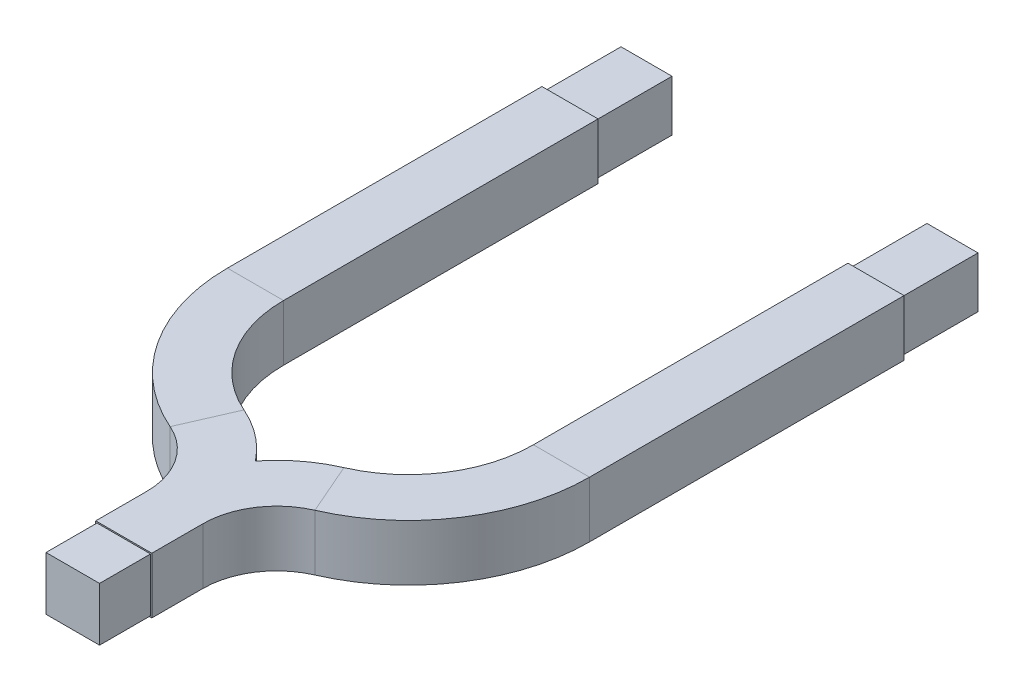
ISO-10303-21;
HEADER;
FILE_DESCRIPTION(('STEP AP214'),'2;1');
FILE_NAME('part.step','',(''),(''),'','','');
FILE_SCHEMA(('AUTOMOTIVE_DESIGN { 1 0 10303 214 1 1 1 1 }'));
ENDSEC;
DATA;
#1=APPLICATION_CONTEXT('core data for automotive mechanical design processes');
#2=APPLICATION_PROTOCOL_DEFINITION('international standard','automotive_design',2000,#1);
#3=PRODUCT_CONTEXT('',#1,'mechanical');
#4=PRODUCT('Part','Part','',(#3));
#5=PRODUCT_RELATED_PRODUCT_CATEGORY('part','',(#4));
#6=PRODUCT_DEFINITION_FORMATION('','',#4);
#7=PRODUCT_DEFINITION_CONTEXT('part definition',#1,'design');
#8=PRODUCT_DEFINITION('design','',#6,#7);
#9=PRODUCT_DEFINITION_SHAPE('','',#8);
#10=(LENGTH_UNIT() NAMED_UNIT(*) SI_UNIT(.MILLI.,.METRE.));
#11=(NAMED_UNIT(*) PLANE_ANGLE_UNIT() SI_UNIT($,.RADIAN.));
#12=(NAMED_UNIT(*) SI_UNIT($,.STERADIAN.) SOLID_ANGLE_UNIT());
#13=UNCERTAINTY_MEASURE_WITH_UNIT(LENGTH_MEASURE(1.E-05),#10,'distance_accuracy_value','');
#14=(GEOMETRIC_REPRESENTATION_CONTEXT(3) GLOBAL_UNCERTAINTY_ASSIGNED_CONTEXT((#13)) GLOBAL_UNIT_ASSIGNED_CONTEXT((#10,
#11,#12)) REPRESENTATION_CONTEXT('',''));
#15=CARTESIAN_POINT('',(0.,0.,0.));
#16=DIRECTION('',(0.,0.,1.));
#17=DIRECTION('',(1.,0.,0.));
#18=AXIS2_PLACEMENT_3D('',#15,#16,#17);
#19=CARTESIAN_POINT('',(-4.99999919028007,-0.999999999999999,-23.5));
#20=DIRECTION('',(0.,1.,0.));
#21=DIRECTION('',(-1.,0.,0.));
#22=AXIS2_PLACEMENT_3D('',#19,#20,#21);
#23=PLANE('',#22);
#24=DIRECTION('',(1.,0.,0.));
#25=VECTOR('',#24,1.);
#26=CARTESIAN_POINT('',(-6.99999919028007,-0.999999999999999,-26.5));
#27=LINE('',#26,#25);
#28=CARTESIAN_POINT('',(-6.99999919028007,-1.,-26.5));
#29=VERTEX_POINT('',#28);
#30=CARTESIAN_POINT('',(-4.99999919028007,-0.999999999999999,-26.5));
#31=VERTEX_POINT('',#30);
#32=EDGE_CURVE('E61',#29,#31,#27,.T.);
#33=ORIENTED_EDGE('',*,*,#32,.T.);
#34=DIRECTION('',(0.,0.,-1.));
#35=VECTOR('',#34,1.);
#36=CARTESIAN_POINT('',(-4.99999919028007,-0.999999999999999,-23.5));
#37=LINE('',#36,#35);
#38=CARTESIAN_POINT('',(-4.99999919028007,-0.999999999999999,-23.5));
#39=VERTEX_POINT('',#38);
#40=EDGE_CURVE('E263',#39,#31,#37,.T.);
#41=ORIENTED_EDGE('',*,*,#40,.F.);
#42=DIRECTION('',(1.,0.,0.));
#43=VECTOR('',#42,1.);
#44=CARTESIAN_POINT('',(-4.99999919028007,-0.999999999999999,-23.5));
#45=LINE('',#44,#43);
#46=CARTESIAN_POINT('',(-6.99999919028007,-1.,-23.5));
#47=VERTEX_POINT('',#46);
#48=EDGE_CURVE('E777',#47,#39,#45,.T.);
#49=ORIENTED_EDGE('',*,*,#48,.F.);
#50=DIRECTION('',(0.,0.,-1.));
#51=VECTOR('',#50,1.);
#52=CARTESIAN_POINT('',(-6.99999919028007,-1.,-23.5));
#53=LINE('',#52,#51);
#54=EDGE_CURVE('E259',#47,#29,#53,.T.);
#55=ORIENTED_EDGE('',*,*,#54,.T.);
#56=EDGE_LOOP('',(#33,#41,#49,#55));
#57=FACE_BOUND('',#56,.T.);
#58=ADVANCED_FACE('F45',(#57),#23,.F.);
#59=CARTESIAN_POINT('',(-4.99999919028007,-0.999999999999999,-23.5));
#60=DIRECTION('',(-1.,0.,0.));
#61=DIRECTION('',(0.,0.,1.));
#62=AXIS2_PLACEMENT_3D('',#59,#60,#61);
#63=PLANE('',#62);
#64=DIRECTION('',(0.,1.,0.));
#65=VECTOR('',#64,1.);
#66=CARTESIAN_POINT('',(-4.99999919028007,1.,-26.5));
#67=LINE('',#66,#65);
#68=CARTESIAN_POINT('',(-4.99999919028007,1.,-26.5));
#69=VERTEX_POINT('',#68);
#70=EDGE_CURVE('E253',#31,#69,#67,.T.);
#71=ORIENTED_EDGE('',*,*,#70,.T.);
#72=DIRECTION('',(0.,0.,-1.));
#73=VECTOR('',#72,1.);
#74=CARTESIAN_POINT('',(-4.99999919028007,1.,-23.5));
#75=LINE('',#74,#73);
#76=CARTESIAN_POINT('',(-4.99999919028007,1.,-23.5));
#77=VERTEX_POINT('',#76);
#78=EDGE_CURVE('E251',#77,#69,#75,.T.);
#79=ORIENTED_EDGE('',*,*,#78,.F.);
#80=DIRECTION('',(0.,1.,0.));
#81=VECTOR('',#80,1.);
#82=CARTESIAN_POINT('',(-4.99999919028007,-0.999999999999999,-23.5));
#83=LINE('',#82,#81);
#84=EDGE_CURVE('E265',#39,#77,#83,.T.);
#85=ORIENTED_EDGE('',*,*,#84,.F.);
#86=ORIENTED_EDGE('',*,*,#40,.T.);
#87=EDGE_LOOP('',(#71,#79,#85,#86));
#88=FACE_BOUND('',#87,.T.);
#89=ADVANCED_FACE('F596',(#88),#63,.F.);
#90=CARTESIAN_POINT('',(-4.99999919028007,1.,-23.5));
#91=DIRECTION('',(0.,-1.,0.));
#92=DIRECTION('',(1.,0.,0.));
#93=AXIS2_PLACEMENT_3D('',#90,#91,#92);
#94=PLANE('',#93);
#95=DIRECTION('',(-1.,0.,0.));
#96=VECTOR('',#95,1.);
#97=CARTESIAN_POINT('',(-6.99999919028007,1.,-26.5));
#98=LINE('',#97,#96);
#99=CARTESIAN_POINT('',(-6.99999919028007,1.,-26.5));
#100=VERTEX_POINT('',#99);
#101=EDGE_CURVE('E236',#69,#100,#98,.T.);
#102=ORIENTED_EDGE('',*,*,#101,.T.);
#103=DIRECTION('',(0.,0.,-1.));
#104=VECTOR('',#103,1.);
#105=CARTESIAN_POINT('',(-6.99999919028007,1.,-23.5));
#106=LINE('',#105,#104);
#107=CARTESIAN_POINT('',(-6.99999919028007,1.,-23.5));
#108=VERTEX_POINT('',#107);
#109=EDGE_CURVE('E248',#108,#100,#106,.T.);
#110=ORIENTED_EDGE('',*,*,#109,.F.);
#111=DIRECTION('',(-1.,0.,0.));
#112=VECTOR('',#111,1.);
#113=CARTESIAN_POINT('',(-4.99999919028007,1.,-23.5));
#114=LINE('',#113,#112);
#115=EDGE_CURVE('E785',#77,#108,#114,.T.);
#116=ORIENTED_EDGE('',*,*,#115,.F.);
#117=ORIENTED_EDGE('',*,*,#78,.T.);
#118=EDGE_LOOP('',(#102,#110,#116,#117));
#119=FACE_BOUND('',#118,.T.);
#120=ADVANCED_FACE('F246',(#119),#94,.F.);
#121=CARTESIAN_POINT('',(-6.99999919028007,-1.,-23.5));
#122=DIRECTION('',(1.,0.,0.));
#123=DIRECTION('',(0.,0.,-1.));
#124=AXIS2_PLACEMENT_3D('',#121,#122,#123);
#125=PLANE('',#124);
#126=DIRECTION('',(0.,-1.,0.));
#127=VECTOR('',#126,1.);
#128=CARTESIAN_POINT('',(-6.99999919028007,1.,-26.5));
#129=LINE('',#128,#127);
#130=EDGE_CURVE('E233',#100,#29,#129,.T.);
#131=ORIENTED_EDGE('',*,*,#130,.T.);
#132=ORIENTED_EDGE('',*,*,#54,.F.);
#133=DIRECTION('',(0.,-1.,0.));
#134=VECTOR('',#133,1.);
#135=CARTESIAN_POINT('',(-6.99999919028007,-1.,-23.5));
#136=LINE('',#135,#134);
#137=EDGE_CURVE('E257',#108,#47,#136,.T.);
#138=ORIENTED_EDGE('',*,*,#137,.F.);
#139=ORIENTED_EDGE('',*,*,#109,.T.);
#140=EDGE_LOOP('',(#131,#132,#138,#139));
#141=FACE_BOUND('',#140,.T.);
#142=ADVANCED_FACE('F256',(#141),#125,.F.);
#143=CARTESIAN_POINT('',(-4.89999919028007,1.1,-28.5));
#144=DIRECTION('',(-1.,0.,0.));
#145=DIRECTION('',(0.,0.,1.));
#146=AXIS2_PLACEMENT_3D('',#143,#144,#145);
#147=PLANE('',#146);
#148=DIRECTION('',(0.,1.,0.));
#149=VECTOR('',#148,1.);
#150=CARTESIAN_POINT('',(-4.89999919028007,-1.1,-23.5));
#151=LINE('',#150,#149);
#152=CARTESIAN_POINT('',(-4.89999919028007,-1.1,-23.5));
#153=VERTEX_POINT('',#152);
#154=CARTESIAN_POINT('',(-4.89999919028007,1.1,-23.5));
#155=VERTEX_POINT('',#154);
#156=EDGE_CURVE('E269',#153,#155,#151,.T.);
#157=ORIENTED_EDGE('',*,*,#156,.T.);
#158=DIRECTION('',(0.,0.,1.));
#159=VECTOR('',#158,1.);
#160=CARTESIAN_POINT('',(-4.89999919028007,1.1,-28.5));
#161=LINE('',#160,#159);
#162=CARTESIAN_POINT('',(-4.89999919028007,1.1,-11.1651484449888));
#163=VERTEX_POINT('',#162);
#164=EDGE_CURVE('E338',#155,#163,#161,.T.);
#165=ORIENTED_EDGE('',*,*,#164,.T.);
#166=DIRECTION('',(0.,1.,0.));
#167=VECTOR('',#166,1.);
#168=CARTESIAN_POINT('',(-4.89999919028007,1.1,-11.1651484449888));
#169=LINE('',#168,#167);
#170=CARTESIAN_POINT('',(-4.89999919028007,-1.1,-11.1651484449888));
#171=VERTEX_POINT('',#170);
#172=EDGE_CURVE('E339',#163,#171,#169,.F.);
#173=ORIENTED_EDGE('',*,*,#172,.T.);
#174=DIRECTION('',(0.,0.,1.));
#175=VECTOR('',#174,1.);
#176=CARTESIAN_POINT('',(-4.89999919028007,-1.1,-28.5));
#177=LINE('',#176,#175);
#178=EDGE_CURVE('E343',#153,#171,#177,.T.);
#179=ORIENTED_EDGE('',*,*,#178,.F.);
#180=EDGE_LOOP('',(#157,#165,#173,#179));
#181=FACE_BOUND('',#180,.T.);
#182=ADVANCED_FACE('F638',(#181),#147,.F.);
#183=CARTESIAN_POINT('',(-7.09999919028007,-1.1,-28.5));
#184=DIRECTION('',(0.,1.,0.));
#185=DIRECTION('',(0.,0.,1.));
#186=AXIS2_PLACEMENT_3D('',#183,#184,#185);
#187=PLANE('',#186);
#188=DIRECTION('',(1.,0.,0.));
#189=VECTOR('',#188,1.);
#190=CARTESIAN_POINT('',(-4.89999919028007,-1.1,-23.5));
#191=LINE('',#190,#189);
#192=CARTESIAN_POINT('',(-7.09999919028007,-1.1,-23.5));
#193=VERTEX_POINT('',#192);
#194=EDGE_CURVE('E273',#193,#153,#191,.T.);
#195=ORIENTED_EDGE('',*,*,#194,.T.);
#196=ORIENTED_EDGE('',*,*,#178,.T.);
#197=DIRECTION('',(1.,0.,0.));
#198=VECTOR('',#197,1.);
#199=CARTESIAN_POINT('',(-7.09999919028007,-1.1,-11.1651484449888));
#200=LINE('',#199,#198);
#201=CARTESIAN_POINT('',(-7.09999919028007,-1.1,-11.1651484449888));
#202=VERTEX_POINT('',#201);
#203=EDGE_CURVE('E346',#171,#202,#200,.F.);
#204=ORIENTED_EDGE('',*,*,#203,.T.);
#205=DIRECTION('',(0.,0.,1.));
#206=VECTOR('',#205,1.);
#207=CARTESIAN_POINT('',(-7.09999919028007,-1.1,-28.5));
#208=LINE('',#207,#206);
#209=EDGE_CURVE('E375',#193,#202,#208,.T.);
#210=ORIENTED_EDGE('',*,*,#209,.F.);
#211=EDGE_LOOP('',(#195,#196,#204,#210));
#212=FACE_BOUND('',#211,.T.);
#213=ADVANCED_FACE('F641',(#212),#187,.F.);
#214=CARTESIAN_POINT('',(-7.09999919028007,1.1,-28.5));
#215=DIRECTION('',(1.,0.,0.));
#216=DIRECTION('',(0.,0.,-1.));
#217=AXIS2_PLACEMENT_3D('',#214,#215,#216);
#218=PLANE('',#217);
#219=DIRECTION('',(0.,-1.,0.));
#220=VECTOR('',#219,1.);
#221=CARTESIAN_POINT('',(-7.09999919028007,-1.1,-23.5));
#222=LINE('',#221,#220);
#223=CARTESIAN_POINT('',(-7.09999919028007,1.1,-23.5));
#224=VERTEX_POINT('',#223);
#225=EDGE_CURVE('E69',#224,#193,#222,.T.);
#226=ORIENTED_EDGE('',*,*,#225,.T.);
#227=ORIENTED_EDGE('',*,*,#209,.T.);
#228=DIRECTION('',(0.,-1.,0.));
#229=VECTOR('',#228,1.);
#230=CARTESIAN_POINT('',(-7.09999919028007,1.1,-11.1651484449888));
#231=LINE('',#230,#229);
#232=CARTESIAN_POINT('',(-7.09999919028007,1.1,-11.1651484449888));
#233=VERTEX_POINT('',#232);
#234=EDGE_CURVE('E378',#202,#233,#231,.F.);
#235=ORIENTED_EDGE('',*,*,#234,.T.);
#236=DIRECTION('',(0.,0.,1.));
#237=VECTOR('',#236,1.);
#238=CARTESIAN_POINT('',(-7.09999919028007,1.1,-28.5));
#239=LINE('',#238,#237);
#240=EDGE_CURVE('E393',#224,#233,#239,.T.);
#241=ORIENTED_EDGE('',*,*,#240,.F.);
#242=EDGE_LOOP('',(#226,#227,#235,#241));
#243=FACE_BOUND('',#242,.T.);
#244=ADVANCED_FACE('F655',(#243),#218,.F.);
#245=CARTESIAN_POINT('',(-7.09999919028007,1.1,-28.5));
#246=DIRECTION('',(0.,-1.,0.));
#247=DIRECTION('',(0.,0.,-1.));
#248=AXIS2_PLACEMENT_3D('',#245,#246,#247);
#249=PLANE('',#248);
#250=DIRECTION('',(-1.,0.,0.));
#251=VECTOR('',#250,1.);
#252=CARTESIAN_POINT('',(-4.89999919028007,1.1,-23.5));
#253=LINE('',#252,#251);
#254=EDGE_CURVE('E279',#155,#224,#253,.T.);
#255=ORIENTED_EDGE('',*,*,#254,.T.);
#256=ORIENTED_EDGE('',*,*,#240,.T.);
#257=DIRECTION('',(-1.,0.,0.));
#258=VECTOR('',#257,1.);
#259=CARTESIAN_POINT('',(-7.09999919028007,1.1,-11.1651484449888));
#260=LINE('',#259,#258);
#261=EDGE_CURVE('E362',#233,#163,#260,.F.);
#262=ORIENTED_EDGE('',*,*,#261,.T.);
#263=ORIENTED_EDGE('',*,*,#164,.F.);
#264=EDGE_LOOP('',(#255,#256,#262,#263));
#265=FACE_BOUND('',#264,.T.);
#266=ADVANCED_FACE('F631',(#265),#249,.F.);
#267=CARTESIAN_POINT('',(4.99999919028007,-0.999999999999999,-23.5));
#268=DIRECTION('',(0.,-1.,0.));
#269=DIRECTION('',(1.,0.,0.));
#270=AXIS2_PLACEMENT_3D('',#267,#268,#269);
#271=PLANE('',#270);
#272=DIRECTION('',(0.,0.,-1.));
#273=VECTOR('',#272,1.);
#274=CARTESIAN_POINT('',(4.99999919028007,-0.999999999999999,-23.5));
#275=LINE('',#274,#273);
#276=CARTESIAN_POINT('',(4.99999919028007,-0.999999999999999,-23.5));
#277=VERTEX_POINT('',#276);
#278=CARTESIAN_POINT('',(4.99999919028007,-0.999999999999999,-26.5));
#279=VERTEX_POINT('',#278);
#280=EDGE_CURVE('E310',#277,#279,#275,.T.);
#281=ORIENTED_EDGE('',*,*,#280,.T.);
#282=DIRECTION('',(-1.,0.,0.));
#283=VECTOR('',#282,1.);
#284=CARTESIAN_POINT('',(6.99999919028007,-0.999999999999999,-26.5));
#285=LINE('',#284,#283);
#286=CARTESIAN_POINT('',(6.99999919028007,-0.999999999999999,-26.5));
#287=VERTEX_POINT('',#286);
#288=EDGE_CURVE('E285',#287,#279,#285,.T.);
#289=ORIENTED_EDGE('',*,*,#288,.F.);
#290=DIRECTION('',(0.,0.,-1.));
#291=VECTOR('',#290,1.);
#292=CARTESIAN_POINT('',(6.99999919028007,-1.,-23.5));
#293=LINE('',#292,#291);
#294=CARTESIAN_POINT('',(6.99999919028007,-1.,-23.5));
#295=VERTEX_POINT('',#294);
#296=EDGE_CURVE('E311',#295,#287,#293,.T.);
#297=ORIENTED_EDGE('',*,*,#296,.F.);
#298=DIRECTION('',(-1.,0.,0.));
#299=VECTOR('',#298,1.);
#300=CARTESIAN_POINT('',(4.99999919028007,-0.999999999999999,-23.5));
#301=LINE('',#300,#299);
#302=EDGE_CURVE('E294',#295,#277,#301,.T.);
#303=ORIENTED_EDGE('',*,*,#302,.T.);
#304=EDGE_LOOP('',(#281,#289,#297,#303));
#305=FACE_BOUND('',#304,.T.);
#306=ADVANCED_FACE('F619',(#305),#271,.T.);
#307=CARTESIAN_POINT('',(6.99999919028007,-1.,-23.5));
#308=DIRECTION('',(1.,0.,0.));
#309=DIRECTION('',(0.,0.,-1.));
#310=AXIS2_PLACEMENT_3D('',#307,#308,#309);
#311=PLANE('',#310);
#312=ORIENTED_EDGE('',*,*,#296,.T.);
#313=DIRECTION('',(0.,-1.,0.));
#314=VECTOR('',#313,1.);
#315=CARTESIAN_POINT('',(6.99999919028007,1.,-26.5));
#316=LINE('',#315,#314);
#317=CARTESIAN_POINT('',(6.99999919028007,1.,-26.5));
#318=VERTEX_POINT('',#317);
#319=EDGE_CURVE('E282',#318,#287,#316,.T.);
#320=ORIENTED_EDGE('',*,*,#319,.F.);
#321=DIRECTION('',(0.,0.,-1.));
#322=VECTOR('',#321,1.);
#323=CARTESIAN_POINT('',(6.99999919028007,1.,-23.5));
#324=LINE('',#323,#322);
#325=CARTESIAN_POINT('',(6.99999919028007,1.,-23.5));
#326=VERTEX_POINT('',#325);
#327=EDGE_CURVE('E316',#326,#318,#324,.T.);
#328=ORIENTED_EDGE('',*,*,#327,.F.);
#329=DIRECTION('',(0.,-1.,0.));
#330=VECTOR('',#329,1.);
#331=CARTESIAN_POINT('',(6.99999919028007,-1.,-23.5));
#332=LINE('',#331,#330);
#333=EDGE_CURVE('E306',#326,#295,#332,.T.);
#334=ORIENTED_EDGE('',*,*,#333,.T.);
#335=EDGE_LOOP('',(#312,#320,#328,#334));
#336=FACE_BOUND('',#335,.T.);
#337=ADVANCED_FACE('F615',(#336),#311,.T.);
#338=CARTESIAN_POINT('',(4.99999919028007,1.,-23.5));
#339=DIRECTION('',(0.,1.,0.));
#340=DIRECTION('',(-1.,0.,0.));
#341=AXIS2_PLACEMENT_3D('',#338,#339,#340);
#342=PLANE('',#341);
#343=ORIENTED_EDGE('',*,*,#327,.T.);
#344=DIRECTION('',(1.,0.,0.));
#345=VECTOR('',#344,1.);
#346=CARTESIAN_POINT('',(6.99999919028007,1.,-26.5));
#347=LINE('',#346,#345);
#348=CARTESIAN_POINT('',(4.99999919028007,1.,-26.5));
#349=VERTEX_POINT('',#348);
#350=EDGE_CURVE('E291',#349,#318,#347,.T.);
#351=ORIENTED_EDGE('',*,*,#350,.F.);
#352=DIRECTION('',(0.,0.,-1.));
#353=VECTOR('',#352,1.);
#354=CARTESIAN_POINT('',(4.99999919028007,1.,-23.5));
#355=LINE('',#354,#353);
#356=CARTESIAN_POINT('',(4.99999919028007,1.,-23.5));
#357=VERTEX_POINT('',#356);
#358=EDGE_CURVE('E320',#357,#349,#355,.T.);
#359=ORIENTED_EDGE('',*,*,#358,.F.);
#360=DIRECTION('',(1.,0.,0.));
#361=VECTOR('',#360,1.);
#362=CARTESIAN_POINT('',(4.99999919028007,1.,-23.5));
#363=LINE('',#362,#361);
#364=EDGE_CURVE('E302',#357,#326,#363,.T.);
#365=ORIENTED_EDGE('',*,*,#364,.T.);
#366=EDGE_LOOP('',(#343,#351,#359,#365));
#367=FACE_BOUND('',#366,.T.);
#368=ADVANCED_FACE('F618',(#367),#342,.T.);
#369=CARTESIAN_POINT('',(4.99999919028007,-0.999999999999999,-23.5));
#370=DIRECTION('',(-1.,0.,0.));
#371=DIRECTION('',(0.,0.,1.));
#372=AXIS2_PLACEMENT_3D('',#369,#370,#371);
#373=PLANE('',#372);
#374=ORIENTED_EDGE('',*,*,#358,.T.);
#375=DIRECTION('',(0.,1.,0.));
#376=VECTOR('',#375,1.);
#377=CARTESIAN_POINT('',(4.99999919028007,1.,-26.5));
#378=LINE('',#377,#376);
#379=EDGE_CURVE('E288',#279,#349,#378,.T.);
#380=ORIENTED_EDGE('',*,*,#379,.F.);
#381=ORIENTED_EDGE('',*,*,#280,.F.);
#382=DIRECTION('',(0.,1.,0.));
#383=VECTOR('',#382,1.);
#384=CARTESIAN_POINT('',(4.99999919028007,-0.999999999999999,-23.5));
#385=LINE('',#384,#383);
#386=EDGE_CURVE('E298',#277,#357,#385,.T.);
#387=ORIENTED_EDGE('',*,*,#386,.T.);
#388=EDGE_LOOP('',(#374,#380,#381,#387));
#389=FACE_BOUND('',#388,.T.);
#390=ADVANCED_FACE('F623',(#389),#373,.T.);
#391=CARTESIAN_POINT('',(7.09999919028007,1.1,-28.5));
#392=DIRECTION('',(-1.,0.,0.));
#393=DIRECTION('',(0.,0.,1.));
#394=AXIS2_PLACEMENT_3D('',#391,#392,#393);
#395=PLANE('',#394);
#396=DIRECTION('',(0.,-1.,0.));
#397=VECTOR('',#396,1.);
#398=CARTESIAN_POINT('',(7.09999919028007,-1.1,-23.5));
#399=LINE('',#398,#397);
#400=CARTESIAN_POINT('',(7.09999919028007,1.1,-23.5));
#401=VERTEX_POINT('',#400);
#402=CARTESIAN_POINT('',(7.09999919028007,-1.1,-23.5));
#403=VERTEX_POINT('',#402);
#404=EDGE_CURVE('E332',#401,#403,#399,.T.);
#405=ORIENTED_EDGE('',*,*,#404,.F.);
#406=DIRECTION('',(0.,0.,1.));
#407=VECTOR('',#406,1.);
#408=CARTESIAN_POINT('',(7.09999919028007,1.1,-28.5));
#409=LINE('',#408,#407);
#410=CARTESIAN_POINT('',(7.09999919028007,1.1,-11.1651484449888));
#411=VERTEX_POINT('',#410);
#412=EDGE_CURVE('E406',#401,#411,#409,.T.);
#413=ORIENTED_EDGE('',*,*,#412,.T.);
#414=DIRECTION('',(0.,-1.,0.));
#415=VECTOR('',#414,1.);
#416=CARTESIAN_POINT('',(7.09999919028007,1.1,-11.1651484449888));
#417=LINE('',#416,#415);
#418=CARTESIAN_POINT('',(7.09999919028007,-1.1,-11.1651484449888));
#419=VERTEX_POINT('',#418);
#420=EDGE_CURVE('E413',#411,#419,#417,.T.);
#421=ORIENTED_EDGE('',*,*,#420,.T.);
#422=DIRECTION('',(0.,0.,1.));
#423=VECTOR('',#422,1.);
#424=CARTESIAN_POINT('',(7.09999919028007,-1.1,-28.5));
#425=LINE('',#424,#423);
#426=EDGE_CURVE('E417',#403,#419,#425,.T.);
#427=ORIENTED_EDGE('',*,*,#426,.F.);
#428=EDGE_LOOP('',(#405,#413,#421,#427));
#429=FACE_BOUND('',#428,.T.);
#430=ADVANCED_FACE('F627',(#429),#395,.F.);
#431=CARTESIAN_POINT('',(7.09999919028007,-1.1,-28.5));
#432=DIRECTION('',(0.,1.,0.));
#433=DIRECTION('',(0.,0.,1.));
#434=AXIS2_PLACEMENT_3D('',#431,#432,#433);
#435=PLANE('',#434);
#436=DIRECTION('',(-1.,0.,0.));
#437=VECTOR('',#436,1.);
#438=CARTESIAN_POINT('',(4.89999919028007,-1.1,-23.5));
#439=LINE('',#438,#437);
#440=CARTESIAN_POINT('',(4.89999919028007,-1.1,-23.5));
#441=VERTEX_POINT('',#440);
#442=EDGE_CURVE('E335',#403,#441,#439,.T.);
#443=ORIENTED_EDGE('',*,*,#442,.F.);
#444=ORIENTED_EDGE('',*,*,#426,.T.);
#445=DIRECTION('',(-1.,0.,0.));
#446=VECTOR('',#445,1.);
#447=CARTESIAN_POINT('',(7.09999919028007,-1.1,-11.1651484449888));
#448=LINE('',#447,#446);
#449=CARTESIAN_POINT('',(4.89999919028007,-1.1,-11.1651484449888));
#450=VERTEX_POINT('',#449);
#451=EDGE_CURVE('E420',#419,#450,#448,.T.);
#452=ORIENTED_EDGE('',*,*,#451,.T.);
#453=DIRECTION('',(0.,0.,1.));
#454=VECTOR('',#453,1.);
#455=CARTESIAN_POINT('',(4.89999919028007,-1.1,-28.5));
#456=LINE('',#455,#454);
#457=EDGE_CURVE('E449',#441,#450,#456,.T.);
#458=ORIENTED_EDGE('',*,*,#457,.F.);
#459=EDGE_LOOP('',(#443,#444,#452,#458));
#460=FACE_BOUND('',#459,.T.);
#461=ADVANCED_FACE('F679',(#460),#435,.F.);
#462=CARTESIAN_POINT('',(4.89999919028007,1.1,-28.5));
#463=DIRECTION('',(1.,0.,0.));
#464=DIRECTION('',(0.,0.,-1.));
#465=AXIS2_PLACEMENT_3D('',#462,#463,#464);
#466=PLANE('',#465);
#467=DIRECTION('',(0.,1.,0.));
#468=VECTOR('',#467,1.);
#469=CARTESIAN_POINT('',(4.89999919028007,-1.1,-23.5));
#470=LINE('',#469,#468);
#471=CARTESIAN_POINT('',(4.89999919028007,1.1,-23.5));
#472=VERTEX_POINT('',#471);
#473=EDGE_CURVE('E315',#441,#472,#470,.T.);
#474=ORIENTED_EDGE('',*,*,#473,.F.);
#475=ORIENTED_EDGE('',*,*,#457,.T.);
#476=DIRECTION('',(0.,1.,0.));
#477=VECTOR('',#476,1.);
#478=CARTESIAN_POINT('',(4.89999919028007,1.1,-11.1651484449888));
#479=LINE('',#478,#477);
#480=CARTESIAN_POINT('',(4.89999919028007,1.1,-11.1651484449888));
#481=VERTEX_POINT('',#480);
#482=EDGE_CURVE('E452',#450,#481,#479,.T.);
#483=ORIENTED_EDGE('',*,*,#482,.T.);
#484=DIRECTION('',(0.,0.,1.));
#485=VECTOR('',#484,1.);
#486=CARTESIAN_POINT('',(4.89999919028007,1.1,-28.5));
#487=LINE('',#486,#485);
#488=EDGE_CURVE('E468',#472,#481,#487,.T.);
#489=ORIENTED_EDGE('',*,*,#488,.F.);
#490=EDGE_LOOP('',(#474,#475,#483,#489));
#491=FACE_BOUND('',#490,.T.);
#492=ADVANCED_FACE('F692',(#491),#466,.F.);
#493=CARTESIAN_POINT('',(7.09999919028007,1.1,-28.5));
#494=DIRECTION('',(0.,-1.,0.));
#495=DIRECTION('',(0.,0.,-1.));
#496=AXIS2_PLACEMENT_3D('',#493,#494,#495);
#497=PLANE('',#496);
#498=DIRECTION('',(1.,0.,0.));
#499=VECTOR('',#498,1.);
#500=CARTESIAN_POINT('',(4.89999919028007,1.1,-23.5));
#501=LINE('',#500,#499);
#502=EDGE_CURVE('E329',#472,#401,#501,.T.);
#503=ORIENTED_EDGE('',*,*,#502,.F.);
#504=ORIENTED_EDGE('',*,*,#488,.T.);
#505=DIRECTION('',(1.,0.,0.));
#506=VECTOR('',#505,1.);
#507=CARTESIAN_POINT('',(7.09999919028007,1.1,-11.1651484449888));
#508=LINE('',#507,#506);
#509=EDGE_CURVE('E436',#481,#411,#508,.T.);
#510=ORIENTED_EDGE('',*,*,#509,.T.);
#511=ORIENTED_EDGE('',*,*,#412,.F.);
#512=EDGE_LOOP('',(#503,#504,#510,#511));
#513=FACE_BOUND('',#512,.T.);
#514=ADVANCED_FACE('F700',(#513),#497,.F.);
#515=CARTESIAN_POINT('',(4.,0.,-2.));
#516=DIRECTION('',(0.,1.,0.));
#517=DIRECTION('',(0.,0.,1.));
#518=AXIS2_PLACEMENT_3D('',#515,#516,#517);
#519=CYLINDRICAL_SURFACE('',#518,5.1);
#520=DIRECTION('',(0.,-1.,0.));
#521=VECTOR('',#520,1.);
#522=CARTESIAN_POINT('',(0.,0.,-5.16385840391127));
#523=LINE('',#522,#521);
#524=CARTESIAN_POINT('',(0.,1.1,-5.16385840391127));
#525=VERTEX_POINT('',#524);
#526=CARTESIAN_POINT('',(0.,-1.1,-5.16385840391127));
#527=VERTEX_POINT('',#526);
#528=EDGE_CURVE('E11',#525,#527,#523,.T.);
#529=ORIENTED_EDGE('',*,*,#528,.F.);
#530=CARTESIAN_POINT('',(4.,1.1,-2.));
#531=DIRECTION('',(0.,1.,0.));
#532=DIRECTION('',(-0.400000107962682,0.,-0.916515091872383));
#533=AXIS2_PLACEMENT_3D('',#530,#531,#532);
#534=CIRCLE('',#533,5.1);
#535=CARTESIAN_POINT('',(1.95999998920373,1.1,-6.67422573168165));
#536=VERTEX_POINT('',#535);
#537=EDGE_CURVE('E464',#536,#525,#534,.T.);
#538=ORIENTED_EDGE('',*,*,#537,.F.);
#539=DIRECTION('',(0.,1.,0.));
#540=VECTOR('',#539,1.);
#541=CARTESIAN_POINT('',(1.95999998920373,1.1,-6.67422573168165));
#542=LINE('',#541,#540);
#543=CARTESIAN_POINT('',(1.95999998920373,-1.1,-6.67422573168165));
#544=VERTEX_POINT('',#543);
#545=EDGE_CURVE('E460',#544,#536,#542,.T.);
#546=ORIENTED_EDGE('',*,*,#545,.F.);
#547=CARTESIAN_POINT('',(4.,-1.1,-2.));
#548=DIRECTION('',(0.,1.,0.));
#549=DIRECTION('',(-0.400000107962682,0.,-0.916515091872383));
#550=AXIS2_PLACEMENT_3D('',#547,#548,#549);
#551=CIRCLE('',#550,5.1);
#552=EDGE_CURVE('E441',#544,#527,#551,.T.);
#553=ORIENTED_EDGE('',*,*,#552,.T.);
#554=EDGE_LOOP('',(#529,#538,#546,#553));
#555=FACE_BOUND('',#554,.T.);
#556=ADVANCED_FACE('F705',(#555),#519,.T.);
#557=CARTESIAN_POINT('',(1.05,1.05,2.));
#558=DIRECTION('',(-1.,0.,0.));
#559=DIRECTION('',(0.,-1.,0.));
#560=AXIS2_PLACEMENT_3D('',#557,#558,#559);
#561=PLANE('',#560);
#562=DIRECTION('',(0.,1.,0.));
#563=VECTOR('',#562,1.);
#564=CARTESIAN_POINT('',(1.05,1.05,0.));
#565=LINE('',#564,#563);
#566=CARTESIAN_POINT('',(1.05,-1.05,0.));
#567=VERTEX_POINT('',#566);
#568=CARTESIAN_POINT('',(1.05,1.05,0.));
#569=VERTEX_POINT('',#568);
#570=EDGE_CURVE('E515',#567,#569,#565,.T.);
#571=ORIENTED_EDGE('',*,*,#570,.T.);
#572=DIRECTION('',(0.,0.,-1.));
#573=VECTOR('',#572,1.);
#574=CARTESIAN_POINT('',(1.05,1.05,2.));
#575=LINE('',#574,#573);
#576=CARTESIAN_POINT('',(1.05,1.05,2.));
#577=VERTEX_POINT('',#576);
#578=EDGE_CURVE('E54',#577,#569,#575,.T.);
#579=ORIENTED_EDGE('',*,*,#578,.F.);
#580=DIRECTION('',(0.,1.,0.));
#581=VECTOR('',#580,1.);
#582=CARTESIAN_POINT('',(1.05,1.05,2.));
#583=LINE('',#582,#581);
#584=CARTESIAN_POINT('',(1.05,-1.05,2.));
#585=VERTEX_POINT('',#584);
#586=EDGE_CURVE('E524',#585,#577,#583,.T.);
#587=ORIENTED_EDGE('',*,*,#586,.F.);
#588=DIRECTION('',(0.,0.,-1.));
#589=VECTOR('',#588,1.);
#590=CARTESIAN_POINT('',(1.05,-1.05,2.));
#591=LINE('',#590,#589);
#592=EDGE_CURVE('E538',#585,#567,#591,.T.);
#593=ORIENTED_EDGE('',*,*,#592,.T.);
#594=EDGE_LOOP('',(#571,#579,#587,#593));
#595=FACE_BOUND('',#594,.T.);
#596=ADVANCED_FACE('F47',(#595),#561,.F.);
#597=CARTESIAN_POINT('',(-1.05,1.05,2.));
#598=DIRECTION('',(0.,-1.,0.));
#599=DIRECTION('',(0.,0.,-1.));
#600=AXIS2_PLACEMENT_3D('',#597,#598,#599);
#601=PLANE('',#600);
#602=DIRECTION('',(-1.,0.,0.));
#603=VECTOR('',#602,1.);
#604=CARTESIAN_POINT('',(-1.05,1.05,0.));
#605=LINE('',#604,#603);
#606=CARTESIAN_POINT('',(-1.05,1.05,0.));
#607=VERTEX_POINT('',#606);
#608=EDGE_CURVE('E542',#569,#607,#605,.T.);
#609=ORIENTED_EDGE('',*,*,#608,.T.);
#610=DIRECTION('',(0.,0.,-1.));
#611=VECTOR('',#610,1.);
#612=CARTESIAN_POINT('',(-1.05,1.05,2.));
#613=LINE('',#612,#611);
#614=CARTESIAN_POINT('',(-1.05,1.05,2.));
#615=VERTEX_POINT('',#614);
#616=EDGE_CURVE('E560',#615,#607,#613,.T.);
#617=ORIENTED_EDGE('',*,*,#616,.F.);
#618=DIRECTION('',(-1.,0.,0.));
#619=VECTOR('',#618,1.);
#620=CARTESIAN_POINT('',(-1.05,1.05,2.));
#621=LINE('',#620,#619);
#622=EDGE_CURVE('E528',#577,#615,#621,.T.);
#623=ORIENTED_EDGE('',*,*,#622,.F.);
#624=ORIENTED_EDGE('',*,*,#578,.T.);
#625=EDGE_LOOP('',(#609,#617,#623,#624));
#626=FACE_BOUND('',#625,.T.);
#627=ADVANCED_FACE('F567',(#626),#601,.F.);
#628=CARTESIAN_POINT('',(-1.05,1.05,2.));
#629=DIRECTION('',(1.,0.,0.));
#630=DIRECTION('',(0.,1.,0.));
#631=AXIS2_PLACEMENT_3D('',#628,#629,#630);
#632=PLANE('',#631);
#633=DIRECTION('',(0.,-1.,0.));
#634=VECTOR('',#633,1.);
#635=CARTESIAN_POINT('',(-1.05,1.05,0.));
#636=LINE('',#635,#634);
#637=CARTESIAN_POINT('',(-1.05,-1.05,0.));
#638=VERTEX_POINT('',#637);
#639=EDGE_CURVE('E546',#607,#638,#636,.T.);
#640=ORIENTED_EDGE('',*,*,#639,.T.);
#641=DIRECTION('',(0.,0.,-1.));
#642=VECTOR('',#641,1.);
#643=CARTESIAN_POINT('',(-1.05,-1.05,2.));
#644=LINE('',#643,#642);
#645=CARTESIAN_POINT('',(-1.05,-1.05,2.));
#646=VERTEX_POINT('',#645);
#647=EDGE_CURVE('E556',#646,#638,#644,.T.);
#648=ORIENTED_EDGE('',*,*,#647,.F.);
#649=DIRECTION('',(0.,-1.,0.));
#650=VECTOR('',#649,1.);
#651=CARTESIAN_POINT('',(-1.05,1.05,2.));
#652=LINE('',#651,#650);
#653=EDGE_CURVE('E532',#615,#646,#652,.T.);
#654=ORIENTED_EDGE('',*,*,#653,.F.);
#655=ORIENTED_EDGE('',*,*,#616,.T.);
#656=EDGE_LOOP('',(#640,#648,#654,#655));
#657=FACE_BOUND('',#656,.T.);
#658=ADVANCED_FACE('F580',(#657),#632,.F.);
#659=CARTESIAN_POINT('',(-1.05,-1.05,2.));
#660=DIRECTION('',(0.,1.,0.));
#661=DIRECTION('',(0.,0.,1.));
#662=AXIS2_PLACEMENT_3D('',#659,#660,#661);
#663=PLANE('',#662);
#664=DIRECTION('',(1.,0.,0.));
#665=VECTOR('',#664,1.);
#666=CARTESIAN_POINT('',(-1.05,-1.05,0.));
#667=LINE('',#666,#665);
#668=EDGE_CURVE('E529',#638,#567,#667,.T.);
#669=ORIENTED_EDGE('',*,*,#668,.T.);
#670=ORIENTED_EDGE('',*,*,#592,.F.);
#671=DIRECTION('',(1.,0.,0.));
#672=VECTOR('',#671,1.);
#673=CARTESIAN_POINT('',(-1.05,-1.05,2.));
#674=LINE('',#673,#672);
#675=EDGE_CURVE('E535',#646,#585,#674,.T.);
#676=ORIENTED_EDGE('',*,*,#675,.F.);
#677=ORIENTED_EDGE('',*,*,#647,.T.);
#678=EDGE_LOOP('',(#669,#670,#676,#677));
#679=FACE_BOUND('',#678,.T.);
#680=ADVANCED_FACE('F575',(#679),#663,.F.);
#681=CARTESIAN_POINT('',(0.,0.,2.));
#682=DIRECTION('',(0.,0.,1.));
#683=DIRECTION('',(1.,0.,0.));
#684=AXIS2_PLACEMENT_3D('',#681,#682,#683);
#685=PLANE('',#684);
#686=ORIENTED_EDGE('',*,*,#586,.T.);
#687=ORIENTED_EDGE('',*,*,#622,.T.);
#688=ORIENTED_EDGE('',*,*,#653,.T.);
#689=ORIENTED_EDGE('',*,*,#675,.T.);
#690=EDGE_LOOP('',(#686,#687,#688,#689));
#691=FACE_BOUND('',#690,.T.);
#692=ADVANCED_FACE('F582',(#691),#685,.T.);
#693=CARTESIAN_POINT('',(0.,0.,0.));
#694=DIRECTION('',(0.,0.,1.));
#695=DIRECTION('',(1.,0.,0.));
#696=AXIS2_PLACEMENT_3D('',#693,#694,#695);
#697=PLANE('',#696);
#698=DIRECTION('',(0.,1.,0.));
#699=VECTOR('',#698,1.);
#700=CARTESIAN_POINT('',(1.1,1.1,0.));
#701=LINE('',#700,#699);
#702=CARTESIAN_POINT('',(1.1,-1.1,0.));
#703=VERTEX_POINT('',#702);
#704=CARTESIAN_POINT('',(1.1,1.1,0.));
#705=VERTEX_POINT('',#704);
#706=EDGE_CURVE('E481',#703,#705,#701,.T.);
#707=ORIENTED_EDGE('',*,*,#706,.T.);
#708=DIRECTION('',(-1.,0.,0.));
#709=VECTOR('',#708,1.);
#710=CARTESIAN_POINT('',(-1.1,1.1,0.));
#711=LINE('',#710,#709);
#712=CARTESIAN_POINT('',(-1.1,1.1,0.));
#713=VERTEX_POINT('',#712);
#714=EDGE_CURVE('E501',#705,#713,#711,.T.);
#715=ORIENTED_EDGE('',*,*,#714,.T.);
#716=DIRECTION('',(0.,-1.,0.));
#717=VECTOR('',#716,1.);
#718=CARTESIAN_POINT('',(-1.1,1.1,0.));
#719=LINE('',#718,#717);
#720=CARTESIAN_POINT('',(-1.1,-1.1,0.));
#721=VERTEX_POINT('',#720);
#722=EDGE_CURVE('E505',#713,#721,#719,.T.);
#723=ORIENTED_EDGE('',*,*,#722,.T.);
#724=DIRECTION('',(1.,0.,0.));
#725=VECTOR('',#724,1.);
#726=CARTESIAN_POINT('',(-1.1,-1.1,0.));
#727=LINE('',#726,#725);
#728=EDGE_CURVE('E493',#721,#703,#727,.T.);
#729=ORIENTED_EDGE('',*,*,#728,.T.);
#730=EDGE_LOOP('',(#707,#715,#723,#729));
#731=FACE_BOUND('',#730,.T.);
#732=ORIENTED_EDGE('',*,*,#570,.F.);
#733=ORIENTED_EDGE('',*,*,#668,.F.);
#734=ORIENTED_EDGE('',*,*,#639,.F.);
#735=ORIENTED_EDGE('',*,*,#608,.F.);
#736=EDGE_LOOP('',(#732,#733,#734,#735));
#737=FACE_BOUND('',#736,.T.);
#738=ADVANCED_FACE('F573',(#731,#737),#697,.T.);
#739=CARTESIAN_POINT('',(1.1,1.1,-2.));
#740=DIRECTION('',(1.,0.,0.));
#741=DIRECTION('',(0.,0.,-1.));
#742=AXIS2_PLACEMENT_3D('',#739,#740,#741);
#743=PLANE('',#742);
#744=ORIENTED_EDGE('',*,*,#706,.F.);
#745=DIRECTION('',(0.,0.,1.));
#746=VECTOR('',#745,1.);
#747=CARTESIAN_POINT('',(1.1,-1.1,-2.));
#748=LINE('',#747,#746);
#749=CARTESIAN_POINT('',(1.1,-1.1,-2.));
#750=VERTEX_POINT('',#749);
#751=EDGE_CURVE('E512',#750,#703,#748,.T.);
#752=ORIENTED_EDGE('',*,*,#751,.F.);
#753=DIRECTION('',(0.,1.,0.));
#754=VECTOR('',#753,1.);
#755=CARTESIAN_POINT('',(1.1,1.1,-2.));
#756=LINE('',#755,#754);
#757=CARTESIAN_POINT('',(1.1,1.1,-2.));
#758=VERTEX_POINT('',#757);
#759=EDGE_CURVE('E488',#750,#758,#756,.T.);
#760=ORIENTED_EDGE('',*,*,#759,.T.);
#761=DIRECTION('',(0.,0.,1.));
#762=VECTOR('',#761,1.);
#763=CARTESIAN_POINT('',(1.1,1.1,-2.));
#764=LINE('',#763,#762);
#765=EDGE_CURVE('E497',#758,#705,#764,.T.);
#766=ORIENTED_EDGE('',*,*,#765,.T.);
#767=EDGE_LOOP('',(#744,#752,#760,#766));
#768=FACE_BOUND('',#767,.T.);
#769=ADVANCED_FACE('F589',(#768),#743,.T.);
#770=CARTESIAN_POINT('',(-1.1,-1.1,-2.));
#771=DIRECTION('',(0.,-1.,0.));
#772=DIRECTION('',(0.,0.,-1.));
#773=AXIS2_PLACEMENT_3D('',#770,#771,#772);
#774=PLANE('',#773);
#775=DIRECTION('',(0.,0.,1.));
#776=VECTOR('',#775,1.);
#777=CARTESIAN_POINT('',(-1.1,-1.1,-2.));
#778=LINE('',#777,#776);
#779=CARTESIAN_POINT('',(-1.1,-1.1,-2.));
#780=VERTEX_POINT('',#779);
#781=EDGE_CURVE('E516',#780,#721,#778,.T.);
#782=ORIENTED_EDGE('',*,*,#781,.F.);
#783=CARTESIAN_POINT('',(-4.,-1.1,-2.));
#784=DIRECTION('',(0.,-1.,0.));
#785=DIRECTION('',(0.400000107962682,0.,-0.916515091872383));
#786=AXIS2_PLACEMENT_3D('',#783,#784,#785);
#787=CIRCLE('',#786,2.9);
#788=CARTESIAN_POINT('',(-2.84000022672163,-1.1,-4.65789252956241));
#789=VERTEX_POINT('',#788);
#790=EDGE_CURVE('E367',#789,#780,#787,.T.);
#791=ORIENTED_EDGE('',*,*,#790,.F.);
#792=DIRECTION('',(0.400000107962682,0.,-0.916515091872383));
#793=VECTOR('',#792,1.);
#794=CARTESIAN_POINT('',(-2.84000022672163,-1.1,-4.65789252956241));
#795=LINE('',#794,#793);
#796=CARTESIAN_POINT('',(-1.95999998920373,-1.1,-6.67422573168165));
#797=VERTEX_POINT('',#796);
#798=EDGE_CURVE('E358',#797,#789,#795,.F.);
#799=ORIENTED_EDGE('',*,*,#798,.F.);
#800=CARTESIAN_POINT('',(-4.,-1.1,-2.));
#801=DIRECTION('',(0.,-1.,0.));
#802=DIRECTION('',(0.400000107962682,0.,-0.916515091872383));
#803=AXIS2_PLACEMENT_3D('',#800,#801,#802);
#804=CIRCLE('',#803,5.1);
#805=EDGE_CURVE('E363',#797,#527,#804,.T.);
#806=ORIENTED_EDGE('',*,*,#805,.T.);
#807=ORIENTED_EDGE('',*,*,#552,.F.);
#808=DIRECTION('',(-0.400000107962682,0.,-0.916515091872383));
#809=VECTOR('',#808,1.);
#810=CARTESIAN_POINT('',(2.84000022672163,-1.1,-4.65789252956241));
#811=LINE('',#810,#809);
#812=CARTESIAN_POINT('',(2.84000022672163,-1.1,-4.65789252956241));
#813=VERTEX_POINT('',#812);
#814=EDGE_CURVE('E432',#813,#544,#811,.T.);
#815=ORIENTED_EDGE('',*,*,#814,.F.);
#816=CARTESIAN_POINT('',(4.,-1.1,-2.));
#817=DIRECTION('',(0.,1.,0.));
#818=DIRECTION('',(-0.400000107962682,0.,-0.916515091872383));
#819=AXIS2_PLACEMENT_3D('',#816,#817,#818);
#820=CIRCLE('',#819,2.9);
#821=EDGE_CURVE('E437',#813,#750,#820,.T.);
#822=ORIENTED_EDGE('',*,*,#821,.T.);
#823=ORIENTED_EDGE('',*,*,#751,.T.);
#824=ORIENTED_EDGE('',*,*,#728,.F.);
#825=EDGE_LOOP('',(#782,#791,#799,#806,#807,#815,#822,#823,#824));
#826=FACE_BOUND('',#825,.T.);
#827=ADVANCED_FACE('F715',(#826),#774,.T.);
#828=CARTESIAN_POINT('',(-1.1,1.1,-2.));
#829=DIRECTION('',(-1.,0.,0.));
#830=DIRECTION('',(0.,0.,1.));
#831=AXIS2_PLACEMENT_3D('',#828,#829,#830);
#832=PLANE('',#831);
#833=ORIENTED_EDGE('',*,*,#722,.F.);
#834=DIRECTION('',(0.,0.,1.));
#835=VECTOR('',#834,1.);
#836=CARTESIAN_POINT('',(-1.1,1.1,-2.));
#837=LINE('',#836,#835);
#838=CARTESIAN_POINT('',(-1.1,1.1,-2.));
#839=VERTEX_POINT('',#838);
#840=EDGE_CURVE('E519',#839,#713,#837,.T.);
#841=ORIENTED_EDGE('',*,*,#840,.F.);
#842=DIRECTION('',(0.,-1.,0.));
#843=VECTOR('',#842,1.);
#844=CARTESIAN_POINT('',(-1.1,1.1,-2.));
#845=LINE('',#844,#843);
#846=EDGE_CURVE('E492',#839,#780,#845,.T.);
#847=ORIENTED_EDGE('',*,*,#846,.T.);
#848=ORIENTED_EDGE('',*,*,#781,.T.);
#849=EDGE_LOOP('',(#833,#841,#847,#848));
#850=FACE_BOUND('',#849,.T.);
#851=ADVANCED_FACE('F718',(#850),#832,.T.);
#852=CARTESIAN_POINT('',(-1.1,1.1,-2.));
#853=DIRECTION('',(0.,1.,0.));
#854=DIRECTION('',(0.,0.,1.));
#855=AXIS2_PLACEMENT_3D('',#852,#853,#854);
#856=PLANE('',#855);
#857=ORIENTED_EDGE('',*,*,#765,.F.);
#858=CARTESIAN_POINT('',(4.,1.1,-2.));
#859=DIRECTION('',(0.,1.,0.));
#860=DIRECTION('',(-0.400000107962682,0.,-0.916515091872383));
#861=AXIS2_PLACEMENT_3D('',#858,#859,#860);
#862=CIRCLE('',#861,2.9);
#863=CARTESIAN_POINT('',(2.84000022672163,1.1,-4.65789252956241));
#864=VERTEX_POINT('',#863);
#865=EDGE_CURVE('E442',#864,#758,#862,.T.);
#866=ORIENTED_EDGE('',*,*,#865,.F.);
#867=DIRECTION('',(0.400000107962682,0.,0.916515091872383));
#868=VECTOR('',#867,1.);
#869=CARTESIAN_POINT('',(2.84000022672163,1.1,-4.65789252956241));
#870=LINE('',#869,#868);
#871=EDGE_CURVE('E445',#536,#864,#870,.T.);
#872=ORIENTED_EDGE('',*,*,#871,.F.);
#873=ORIENTED_EDGE('',*,*,#537,.T.);
#874=CARTESIAN_POINT('',(-4.,1.1,-2.));
#875=DIRECTION('',(0.,-1.,0.));
#876=DIRECTION('',(0.400000107962682,0.,-0.916515091872383));
#877=AXIS2_PLACEMENT_3D('',#874,#875,#876);
#878=CIRCLE('',#877,5.1);
#879=CARTESIAN_POINT('',(-1.95999998920373,1.1,-6.67422573168165));
#880=VERTEX_POINT('',#879);
#881=EDGE_CURVE('E368',#880,#525,#878,.T.);
#882=ORIENTED_EDGE('',*,*,#881,.F.);
#883=DIRECTION('',(-0.400000107962682,0.,0.916515091872383));
#884=VECTOR('',#883,1.);
#885=CARTESIAN_POINT('',(-2.84000022672163,1.1,-4.65789252956241));
#886=LINE('',#885,#884);
#887=CARTESIAN_POINT('',(-2.84000022672163,1.1,-4.65789252956241));
#888=VERTEX_POINT('',#887);
#889=EDGE_CURVE('E371',#888,#880,#886,.F.);
#890=ORIENTED_EDGE('',*,*,#889,.F.);
#891=CARTESIAN_POINT('',(-4.,1.1,-2.));
#892=DIRECTION('',(0.,-1.,0.));
#893=DIRECTION('',(0.400000107962682,0.,-0.916515091872383));
#894=AXIS2_PLACEMENT_3D('',#891,#892,#893);
#895=CIRCLE('',#894,2.9);
#896=EDGE_CURVE('E389',#888,#839,#895,.T.);
#897=ORIENTED_EDGE('',*,*,#896,.T.);
#898=ORIENTED_EDGE('',*,*,#840,.T.);
#899=ORIENTED_EDGE('',*,*,#714,.F.);
#900=EDGE_LOOP('',(#857,#866,#872,#873,#882,#890,#897,#898,#899));
#901=FACE_BOUND('',#900,.T.);
#902=ADVANCED_FACE('F684',(#901),#856,.T.);
#903=CARTESIAN_POINT('',(0.,0.,-11.1651484449888));
#904=DIRECTION('',(0.,-1.,0.));
#905=DIRECTION('',(0.,0.,-1.));
#906=AXIS2_PLACEMENT_3D('',#903,#904,#905);
#907=CYLINDRICAL_SURFACE('',#906,7.09999865046684);
#908=CARTESIAN_POINT('',(0.,-1.1,-11.1651484449888));
#909=DIRECTION('',(0.,-1.,0.));
#910=DIRECTION('',(1.,0.,0.));
#911=AXIS2_PLACEMENT_3D('',#908,#909,#910);
#912=CIRCLE('',#911,7.09999865046684);
#913=EDGE_CURVE('E427',#419,#813,#912,.T.);
#914=ORIENTED_EDGE('',*,*,#913,.F.);
#915=ORIENTED_EDGE('',*,*,#420,.F.);
#916=CARTESIAN_POINT('',(0.,1.1,-11.1651484449888));
#917=DIRECTION('',(0.,-1.,0.));
#918=DIRECTION('',(1.,0.,0.));
#919=AXIS2_PLACEMENT_3D('',#916,#917,#918);
#920=CIRCLE('',#919,7.09999865046684);
#921=EDGE_CURVE('E428',#411,#864,#920,.T.);
#922=ORIENTED_EDGE('',*,*,#921,.T.);
#923=DIRECTION('',(0.,-1.,0.));
#924=VECTOR('',#923,1.);
#925=CARTESIAN_POINT('',(2.84000022672163,1.1,-4.65789252956241));
#926=LINE('',#925,#924);
#927=EDGE_CURVE('E423',#864,#813,#926,.T.);
#928=ORIENTED_EDGE('',*,*,#927,.T.);
#929=EDGE_LOOP('',(#914,#915,#922,#928));
#930=FACE_BOUND('',#929,.T.);
#931=ADVANCED_FACE('F652',(#930),#907,.T.);
#932=CARTESIAN_POINT('',(7.09999865046684,-1.1,-11.1651484449888));
#933=DIRECTION('',(0.,1.,0.));
#934=DIRECTION('',(0.,0.,1.));
#935=AXIS2_PLACEMENT_3D('',#932,#933,#934);
#936=PLANE('',#935);
#937=CARTESIAN_POINT('',(0.,-1.1,-11.1651484449888));
#938=DIRECTION('',(0.,-1.,0.));
#939=DIRECTION('',(1.,0.,0.));
#940=AXIS2_PLACEMENT_3D('',#937,#938,#939);
#941=CIRCLE('',#940,4.89999865046684);
#942=EDGE_CURVE('E456',#450,#544,#941,.T.);
#943=ORIENTED_EDGE('',*,*,#942,.F.);
#944=ORIENTED_EDGE('',*,*,#451,.F.);
#945=ORIENTED_EDGE('',*,*,#913,.T.);
#946=ORIENTED_EDGE('',*,*,#814,.T.);
#947=EDGE_LOOP('',(#943,#944,#945,#946));
#948=FACE_BOUND('',#947,.T.);
#949=ADVANCED_FACE('F683',(#948),#936,.F.);
#950=CARTESIAN_POINT('',(0.,0.,-11.1651484449888));
#951=DIRECTION('',(0.,-1.,0.));
#952=DIRECTION('',(0.,0.,-1.));
#953=AXIS2_PLACEMENT_3D('',#950,#951,#952);
#954=CYLINDRICAL_SURFACE('',#953,4.89999865046684);
#955=CARTESIAN_POINT('',(0.,1.1,-11.1651484449888));
#956=DIRECTION('',(0.,-1.,0.));
#957=DIRECTION('',(1.,0.,0.));
#958=AXIS2_PLACEMENT_3D('',#955,#956,#957);
#959=CIRCLE('',#958,4.89999865046684);
#960=EDGE_CURVE('E474',#481,#536,#959,.T.);
#961=ORIENTED_EDGE('',*,*,#960,.F.);
#962=ORIENTED_EDGE('',*,*,#482,.F.);
#963=ORIENTED_EDGE('',*,*,#942,.T.);
#964=ORIENTED_EDGE('',*,*,#545,.T.);
#965=EDGE_LOOP('',(#961,#962,#963,#964));
#966=FACE_BOUND('',#965,.T.);
#967=ADVANCED_FACE('F696',(#966),#954,.F.);
#968=CARTESIAN_POINT('',(7.09999865046684,1.1,-11.1651484449888));
#969=DIRECTION('',(0.,-1.,0.));
#970=DIRECTION('',(0.,0.,-1.));
#971=AXIS2_PLACEMENT_3D('',#968,#969,#970);
#972=PLANE('',#971);
#973=ORIENTED_EDGE('',*,*,#871,.T.);
#974=ORIENTED_EDGE('',*,*,#921,.F.);
#975=ORIENTED_EDGE('',*,*,#509,.F.);
#976=ORIENTED_EDGE('',*,*,#960,.T.);
#977=EDGE_LOOP('',(#973,#974,#975,#976));
#978=FACE_BOUND('',#977,.T.);
#979=ADVANCED_FACE('F688',(#978),#972,.F.);
#980=CARTESIAN_POINT('',(4.,0.,-2.));
#981=DIRECTION('',(0.,1.,0.));
#982=DIRECTION('',(0.,0.,1.));
#983=AXIS2_PLACEMENT_3D('',#980,#981,#982);
#984=CYLINDRICAL_SURFACE('',#983,2.9);
#985=ORIENTED_EDGE('',*,*,#821,.F.);
#986=ORIENTED_EDGE('',*,*,#927,.F.);
#987=ORIENTED_EDGE('',*,*,#865,.T.);
#988=ORIENTED_EDGE('',*,*,#759,.F.);
#989=EDGE_LOOP('',(#985,#986,#987,#988));
#990=FACE_BOUND('',#989,.T.);
#991=ADVANCED_FACE('F650',(#990),#984,.F.);
#992=CARTESIAN_POINT('',(-4.,0.,-2.));
#993=DIRECTION('',(0.,-1.,0.));
#994=DIRECTION('',(0.,0.,-1.));
#995=AXIS2_PLACEMENT_3D('',#992,#993,#994);
#996=CYLINDRICAL_SURFACE('',#995,5.1);
#997=ORIENTED_EDGE('',*,*,#881,.T.);
#998=ORIENTED_EDGE('',*,*,#528,.T.);
#999=ORIENTED_EDGE('',*,*,#805,.F.);
#1000=DIRECTION('',(0.,1.,0.));
#1001=VECTOR('',#1000,1.);
#1002=CARTESIAN_POINT('',(-1.95999998920373,1.1,-6.67422573168165));
#1003=LINE('',#1002,#1001);
#1004=EDGE_CURVE('E349',#880,#797,#1003,.F.);
#1005=ORIENTED_EDGE('',*,*,#1004,.F.);
#1006=EDGE_LOOP('',(#997,#998,#999,#1005));
#1007=FACE_BOUND('',#1006,.T.);
#1008=ADVANCED_FACE('F646',(#1007),#996,.T.);
#1009=CARTESIAN_POINT('',(0.,0.,-11.1651484449888));
#1010=DIRECTION('',(0.,1.,0.));
#1011=DIRECTION('',(0.,0.,1.));
#1012=AXIS2_PLACEMENT_3D('',#1009,#1010,#1011);
#1013=CYLINDRICAL_SURFACE('',#1012,4.89999865046684);
#1014=CARTESIAN_POINT('',(0.,-1.1,-11.1651484449888));
#1015=DIRECTION('',(0.,1.,0.));
#1016=DIRECTION('',(-1.,0.,0.));
#1017=AXIS2_PLACEMENT_3D('',#1014,#1015,#1016);
#1018=CIRCLE('',#1017,4.89999865046684);
#1019=EDGE_CURVE('E353',#171,#797,#1018,.T.);
#1020=ORIENTED_EDGE('',*,*,#1019,.F.);
#1021=ORIENTED_EDGE('',*,*,#172,.F.);
#1022=CARTESIAN_POINT('',(0.,1.1,-11.1651484449888));
#1023=DIRECTION('',(0.,1.,0.));
#1024=DIRECTION('',(-1.,0.,0.));
#1025=AXIS2_PLACEMENT_3D('',#1022,#1023,#1024);
#1026=CIRCLE('',#1025,4.89999865046684);
#1027=EDGE_CURVE('E354',#163,#880,#1026,.T.);
#1028=ORIENTED_EDGE('',*,*,#1027,.T.);
#1029=ORIENTED_EDGE('',*,*,#1004,.T.);
#1030=EDGE_LOOP('',(#1020,#1021,#1028,#1029));
#1031=FACE_BOUND('',#1030,.T.);
#1032=ADVANCED_FACE('F637',(#1031),#1013,.F.);
#1033=CARTESIAN_POINT('',(-7.09999865046684,-1.1,-11.1651484449888));
#1034=DIRECTION('',(0.,1.,0.));
#1035=DIRECTION('',(0.,0.,1.));
#1036=AXIS2_PLACEMENT_3D('',#1033,#1034,#1035);
#1037=PLANE('',#1036);
#1038=CARTESIAN_POINT('',(0.,-1.1,-11.1651484449888));
#1039=DIRECTION('',(0.,1.,0.));
#1040=DIRECTION('',(-1.,0.,0.));
#1041=AXIS2_PLACEMENT_3D('',#1038,#1039,#1040);
#1042=CIRCLE('',#1041,7.09999865046684);
#1043=EDGE_CURVE('E382',#202,#789,#1042,.T.);
#1044=ORIENTED_EDGE('',*,*,#1043,.F.);
#1045=ORIENTED_EDGE('',*,*,#203,.F.);
#1046=ORIENTED_EDGE('',*,*,#1019,.T.);
#1047=ORIENTED_EDGE('',*,*,#798,.T.);
#1048=EDGE_LOOP('',(#1044,#1045,#1046,#1047));
#1049=FACE_BOUND('',#1048,.T.);
#1050=ADVANCED_FACE('F645',(#1049),#1037,.F.);
#1051=CARTESIAN_POINT('',(0.,0.,-11.1651484449888));
#1052=DIRECTION('',(0.,1.,0.));
#1053=DIRECTION('',(0.,0.,1.));
#1054=AXIS2_PLACEMENT_3D('',#1051,#1052,#1053);
#1055=CYLINDRICAL_SURFACE('',#1054,7.09999865046684);
#1056=CARTESIAN_POINT('',(0.,1.1,-11.1651484449888));
#1057=DIRECTION('',(0.,1.,0.));
#1058=DIRECTION('',(-1.,0.,0.));
#1059=AXIS2_PLACEMENT_3D('',#1056,#1057,#1058);
#1060=CIRCLE('',#1059,7.09999865046684);
#1061=EDGE_CURVE('E399',#233,#888,#1060,.T.);
#1062=ORIENTED_EDGE('',*,*,#1061,.F.);
#1063=ORIENTED_EDGE('',*,*,#234,.F.);
#1064=ORIENTED_EDGE('',*,*,#1043,.T.);
#1065=DIRECTION('',(0.,-1.,0.));
#1066=VECTOR('',#1065,1.);
#1067=CARTESIAN_POINT('',(-2.84000022672163,1.1,-4.65789252956241));
#1068=LINE('',#1067,#1066);
#1069=EDGE_CURVE('E386',#789,#888,#1068,.F.);
#1070=ORIENTED_EDGE('',*,*,#1069,.T.);
#1071=EDGE_LOOP('',(#1062,#1063,#1064,#1070));
#1072=FACE_BOUND('',#1071,.T.);
#1073=ADVANCED_FACE('F659',(#1072),#1055,.T.);
#1074=CARTESIAN_POINT('',(-7.09999865046684,1.1,-11.1651484449888));
#1075=DIRECTION('',(0.,-1.,0.));
#1076=DIRECTION('',(0.,0.,-1.));
#1077=AXIS2_PLACEMENT_3D('',#1074,#1075,#1076);
#1078=PLANE('',#1077);
#1079=ORIENTED_EDGE('',*,*,#889,.T.);
#1080=ORIENTED_EDGE('',*,*,#1027,.F.);
#1081=ORIENTED_EDGE('',*,*,#261,.F.);
#1082=ORIENTED_EDGE('',*,*,#1061,.T.);
#1083=EDGE_LOOP('',(#1079,#1080,#1081,#1082));
#1084=FACE_BOUND('',#1083,.T.);
#1085=ADVANCED_FACE('F666',(#1084),#1078,.F.);
#1086=CARTESIAN_POINT('',(-4.,0.,-2.));
#1087=DIRECTION('',(0.,-1.,0.));
#1088=DIRECTION('',(0.,0.,-1.));
#1089=AXIS2_PLACEMENT_3D('',#1086,#1087,#1088);
#1090=CYLINDRICAL_SURFACE('',#1089,2.9);
#1091=ORIENTED_EDGE('',*,*,#896,.F.);
#1092=ORIENTED_EDGE('',*,*,#1069,.F.);
#1093=ORIENTED_EDGE('',*,*,#790,.T.);
#1094=ORIENTED_EDGE('',*,*,#846,.F.);
#1095=EDGE_LOOP('',(#1091,#1092,#1093,#1094));
#1096=FACE_BOUND('',#1095,.T.);
#1097=ADVANCED_FACE('F635',(#1096),#1090,.F.);
#1098=CARTESIAN_POINT('',(0.,0.,-23.5));
#1099=DIRECTION('',(0.,0.,-1.));
#1100=DIRECTION('',(-1.,0.,0.));
#1101=AXIS2_PLACEMENT_3D('',#1098,#1099,#1100);
#1102=PLANE('',#1101);
#1103=ORIENTED_EDGE('',*,*,#333,.F.);
#1104=ORIENTED_EDGE('',*,*,#364,.F.);
#1105=ORIENTED_EDGE('',*,*,#386,.F.);
#1106=ORIENTED_EDGE('',*,*,#302,.F.);
#1107=EDGE_LOOP('',(#1103,#1104,#1105,#1106));
#1108=FACE_BOUND('',#1107,.T.);
#1109=ORIENTED_EDGE('',*,*,#473,.T.);
#1110=ORIENTED_EDGE('',*,*,#502,.T.);
#1111=ORIENTED_EDGE('',*,*,#404,.T.);
#1112=ORIENTED_EDGE('',*,*,#442,.T.);
#1113=EDGE_LOOP('',(#1109,#1110,#1111,#1112));
#1114=FACE_BOUND('',#1113,.T.);
#1115=ADVANCED_FACE('F613',(#1108,#1114),#1102,.T.);
#1116=CARTESIAN_POINT('',(0.,0.,-26.5));
#1117=DIRECTION('',(0.,0.,-1.));
#1118=DIRECTION('',(-1.,0.,0.));
#1119=AXIS2_PLACEMENT_3D('',#1116,#1117,#1118);
#1120=PLANE('',#1119);
#1121=ORIENTED_EDGE('',*,*,#319,.T.);
#1122=ORIENTED_EDGE('',*,*,#288,.T.);
#1123=ORIENTED_EDGE('',*,*,#379,.T.);
#1124=ORIENTED_EDGE('',*,*,#350,.T.);
#1125=EDGE_LOOP('',(#1121,#1122,#1123,#1124));
#1126=FACE_BOUND('',#1125,.T.);
#1127=ADVANCED_FACE('F611',(#1126),#1120,.T.);
#1128=CARTESIAN_POINT('',(0.,0.,-23.5));
#1129=DIRECTION('',(0.,0.,-1.));
#1130=DIRECTION('',(1.,0.,0.));
#1131=AXIS2_PLACEMENT_3D('',#1128,#1129,#1130);
#1132=PLANE('',#1131);
#1133=ORIENTED_EDGE('',*,*,#156,.F.);
#1134=ORIENTED_EDGE('',*,*,#194,.F.);
#1135=ORIENTED_EDGE('',*,*,#225,.F.);
#1136=ORIENTED_EDGE('',*,*,#254,.F.);
#1137=EDGE_LOOP('',(#1133,#1134,#1135,#1136));
#1138=FACE_BOUND('',#1137,.T.);
#1139=ORIENTED_EDGE('',*,*,#48,.T.);
#1140=ORIENTED_EDGE('',*,*,#84,.T.);
#1141=ORIENTED_EDGE('',*,*,#115,.T.);
#1142=ORIENTED_EDGE('',*,*,#137,.T.);
#1143=EDGE_LOOP('',(#1139,#1140,#1141,#1142));
#1144=FACE_BOUND('',#1143,.T.);
#1145=ADVANCED_FACE('F608',(#1138,#1144),#1132,.T.);
#1146=CARTESIAN_POINT('',(0.,0.,-26.5));
#1147=DIRECTION('',(0.,0.,-1.));
#1148=DIRECTION('',(1.,0.,0.));
#1149=AXIS2_PLACEMENT_3D('',#1146,#1147,#1148);
#1150=PLANE('',#1149);
#1151=ORIENTED_EDGE('',*,*,#130,.F.);
#1152=ORIENTED_EDGE('',*,*,#101,.F.);
#1153=ORIENTED_EDGE('',*,*,#70,.F.);
#1154=ORIENTED_EDGE('',*,*,#32,.F.);
#1155=EDGE_LOOP('',(#1151,#1152,#1153,#1154));
#1156=FACE_BOUND('',#1155,.T.);
#1157=ADVANCED_FACE('F235',(#1156),#1150,.T.);
#1158=CLOSED_SHELL('',(#58,#89,#120,#142,#182,#213,#244,#266,#306,#337,#368,#390,#430,#461,#492,
#514,#556,#596,#627,#658,#680,#692,#738,#769,#827,#851,#902,#931,#949,#967,#979,#991,#1008,
#1032,#1050,#1073,#1085,#1097,#1115,#1127,#1145,#1157));
#1159=MANIFOLD_SOLID_BREP('B2',#1158);
#1160=ADVANCED_BREP_SHAPE_REPRESENTATION('',(#18,#1159),#14);
#1161=SHAPE_DEFINITION_REPRESENTATION(#9,#1160);
ENDSEC;
END-ISO-10303-21;
